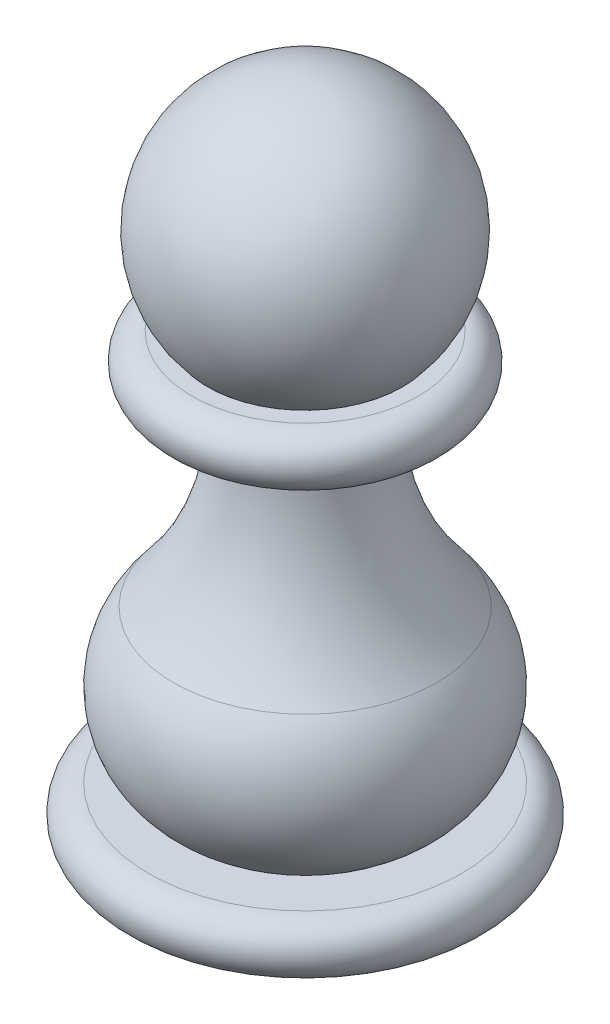
ISO-10303-21;
HEADER;
FILE_DESCRIPTION(('STEP AP214'),'2;1');
FILE_NAME('part.step','',(''),(''),'','','');
FILE_SCHEMA(('AUTOMOTIVE_DESIGN { 1 0 10303 214 1 1 1 1 }'));
ENDSEC;
DATA;
#1=APPLICATION_CONTEXT('core data for automotive mechanical design processes');
#2=APPLICATION_PROTOCOL_DEFINITION('international standard','automotive_design',2000,#1);
#3=PRODUCT_CONTEXT('',#1,'mechanical');
#4=PRODUCT('Part','Part','',(#3));
#5=PRODUCT_RELATED_PRODUCT_CATEGORY('part','',(#4));
#6=PRODUCT_DEFINITION_FORMATION('','',#4);
#7=PRODUCT_DEFINITION_CONTEXT('part definition',#1,'design');
#8=PRODUCT_DEFINITION('design','',#6,#7);
#9=PRODUCT_DEFINITION_SHAPE('','',#8);
#10=(LENGTH_UNIT() NAMED_UNIT(*) SI_UNIT(.MILLI.,.METRE.));
#11=(NAMED_UNIT(*) PLANE_ANGLE_UNIT() SI_UNIT($,.RADIAN.));
#12=(NAMED_UNIT(*) SI_UNIT($,.STERADIAN.) SOLID_ANGLE_UNIT());
#13=UNCERTAINTY_MEASURE_WITH_UNIT(LENGTH_MEASURE(1.E-05),#10,'distance_accuracy_value','');
#14=(GEOMETRIC_REPRESENTATION_CONTEXT(3) GLOBAL_UNCERTAINTY_ASSIGNED_CONTEXT((#13)) GLOBAL_UNIT_ASSIGNED_CONTEXT((#10,
#11,#12)) REPRESENTATION_CONTEXT('',''));
#15=CARTESIAN_POINT('',(0.,0.,0.));
#16=DIRECTION('',(0.,0.,1.));
#17=DIRECTION('',(1.,0.,0.));
#18=AXIS2_PLACEMENT_3D('',#15,#16,#17);
#19=CARTESIAN_POINT('',(0.,0.,0.));
#20=DIRECTION('',(0.,-1.,0.));
#21=DIRECTION('',(0.,0.,-1.));
#22=AXIS2_PLACEMENT_3D('',#19,#20,#21);
#23=PLANE('',#22);
#24=CARTESIAN_POINT('',(0.,0.,0.));
#25=DIRECTION('',(0.,-1.,0.));
#26=DIRECTION('',(0.,0.,-1.));
#27=AXIS2_PLACEMENT_3D('',#24,#25,#26);
#28=CIRCLE('',#27,9.);
#29=CARTESIAN_POINT('',(0.,0.,-9.));
#30=VERTEX_POINT('',#29);
#31=EDGE_CURVE('E10',#30,#30,#28,.T.);
#32=ORIENTED_EDGE('',*,*,#31,.T.);
#33=EDGE_LOOP('',(#32));
#34=FACE_BOUND('',#33,.T.);
#35=ADVANCED_FACE('F37',(#34),#23,.T.);
#36=CARTESIAN_POINT('',(0.,1.5,0.));
#37=DIRECTION('',(0.,-1.,0.));
#38=DIRECTION('',(0.,0.,-1.));
#39=AXIS2_PLACEMENT_3D('',#36,#37,#38);
#40=TOROIDAL_SURFACE('',#39,9.,1.5);
#41=CARTESIAN_POINT('',(0.,3.,0.));
#42=DIRECTION('',(0.,-1.,0.));
#43=DIRECTION('',(0.,0.,-1.));
#44=AXIS2_PLACEMENT_3D('',#41,#42,#43);
#45=CIRCLE('',#44,9.);
#46=CARTESIAN_POINT('',(0.,3.,-9.));
#47=VERTEX_POINT('',#46);
#48=EDGE_CURVE('E43',#47,#47,#45,.T.);
#49=ORIENTED_EDGE('',*,*,#48,.T.);
#50=EDGE_LOOP('',(#49));
#51=FACE_BOUND('',#50,.T.);
#52=ORIENTED_EDGE('',*,*,#31,.F.);
#53=EDGE_LOOP('',(#52));
#54=FACE_BOUND('',#53,.T.);
#55=ADVANCED_FACE('F81',(#51,#54),#40,.T.);
#56=CARTESIAN_POINT('',(9.,3.,0.));
#57=DIRECTION('',(0.,1.,0.));
#58=DIRECTION('',(0.,0.,1.));
#59=AXIS2_PLACEMENT_3D('',#56,#57,#58);
#60=PLANE('',#59);
#61=CARTESIAN_POINT('',(0.,3.,0.));
#62=DIRECTION('',(0.,-1.,0.));
#63=DIRECTION('',(0.,0.,-1.));
#64=AXIS2_PLACEMENT_3D('',#61,#62,#63);
#65=CIRCLE('',#64,6.5);
#66=CARTESIAN_POINT('',(0.,3.,-6.5));
#67=VERTEX_POINT('',#66);
#68=EDGE_CURVE('E47',#67,#67,#65,.T.);
#69=ORIENTED_EDGE('',*,*,#68,.T.);
#70=EDGE_LOOP('',(#69));
#71=FACE_BOUND('',#70,.T.);
#72=ORIENTED_EDGE('',*,*,#48,.F.);
#73=EDGE_LOOP('',(#72));
#74=FACE_BOUND('',#73,.T.);
#75=ADVANCED_FACE('F85',(#71,#74),#60,.T.);
#76=CARTESIAN_POINT('',(0.,7.87339717240448,0.));
#77=DIRECTION('',(0.,-1.,0.));
#78=DIRECTION('',(0.,0.,-1.));
#79=AXIS2_PLACEMENT_3D('',#76,#77,#78);
#80=DEGENERATE_TOROIDAL_SURFACE('',#79,3.,6.,.T.);
#81=CARTESIAN_POINT('',(0.,11.7704306233132,0.));
#82=DIRECTION('',(0.,-1.,0.));
#83=DIRECTION('',(0.,0.,-1.));
#84=AXIS2_PLACEMENT_3D('',#81,#82,#83);
#85=CIRCLE('',#84,7.56214097573703);
#86=CARTESIAN_POINT('',(0.,11.7704306233132,-7.56214097573703));
#87=VERTEX_POINT('',#86);
#88=EDGE_CURVE('E51',#87,#87,#85,.T.);
#89=ORIENTED_EDGE('',*,*,#88,.T.);
#90=EDGE_LOOP('',(#89));
#91=FACE_BOUND('',#90,.T.);
#92=ORIENTED_EDGE('',*,*,#68,.F.);
#93=EDGE_LOOP('',(#92));
#94=FACE_BOUND('',#93,.T.);
#95=ADVANCED_FACE('F89',(#91,#94),#80,.T.);
#96=CARTESIAN_POINT('',(0.,21.5130142505848,0.));
#97=DIRECTION('',(0.,-1.,0.));
#98=DIRECTION('',(0.,0.,-1.));
#99=AXIS2_PLACEMENT_3D('',#96,#97,#98);
#100=TOROIDAL_SURFACE('',#99,18.9674934150796,15.);
#101=CARTESIAN_POINT('',(0.,22.5,0.));
#102=DIRECTION('',(0.,-1.,0.));
#103=DIRECTION('',(0.,0.,-1.));
#104=AXIS2_PLACEMENT_3D('',#101,#102,#103);
#105=CIRCLE('',#104,4.);
#106=CARTESIAN_POINT('',(0.,22.5,-4.));
#107=VERTEX_POINT('',#106);
#108=EDGE_CURVE('E56',#107,#107,#105,.T.);
#109=ORIENTED_EDGE('',*,*,#108,.T.);
#110=EDGE_LOOP('',(#109));
#111=FACE_BOUND('',#110,.T.);
#112=ORIENTED_EDGE('',*,*,#88,.F.);
#113=EDGE_LOOP('',(#112));
#114=FACE_BOUND('',#113,.T.);
#115=ADVANCED_FACE('F96',(#111,#114),#100,.F.);
#116=CARTESIAN_POINT('',(4.,22.5,0.));
#117=DIRECTION('',(0.,-1.,0.));
#118=DIRECTION('',(0.,0.,-1.));
#119=AXIS2_PLACEMENT_3D('',#116,#117,#118);
#120=PLANE('',#119);
#121=CARTESIAN_POINT('',(0.,22.5,0.));
#122=DIRECTION('',(0.,-1.,0.));
#123=DIRECTION('',(0.,0.,-1.));
#124=AXIS2_PLACEMENT_3D('',#121,#122,#123);
#125=CIRCLE('',#124,6.5);
#126=CARTESIAN_POINT('',(0.,22.5,-6.5));
#127=VERTEX_POINT('',#126);
#128=EDGE_CURVE('E59',#127,#127,#125,.T.);
#129=ORIENTED_EDGE('',*,*,#128,.T.);
#130=EDGE_LOOP('',(#129));
#131=FACE_BOUND('',#130,.T.);
#132=ORIENTED_EDGE('',*,*,#108,.F.);
#133=EDGE_LOOP('',(#132));
#134=FACE_BOUND('',#133,.T.);
#135=ADVANCED_FACE('F100',(#131,#134),#120,.T.);
#136=CARTESIAN_POINT('',(0.,24.,0.));
#137=DIRECTION('',(0.,-1.,0.));
#138=DIRECTION('',(0.,0.,-1.));
#139=AXIS2_PLACEMENT_3D('',#136,#137,#138);
#140=TOROIDAL_SURFACE('',#139,6.5,1.5);
#141=CARTESIAN_POINT('',(0.,25.5,0.));
#142=DIRECTION('',(0.,-1.,0.));
#143=DIRECTION('',(0.,0.,-1.));
#144=AXIS2_PLACEMENT_3D('',#141,#142,#143);
#145=CIRCLE('',#144,6.5);
#146=CARTESIAN_POINT('',(0.,25.5,-6.5));
#147=VERTEX_POINT('',#146);
#148=EDGE_CURVE('E62',#147,#147,#145,.T.);
#149=ORIENTED_EDGE('',*,*,#148,.T.);
#150=EDGE_LOOP('',(#149));
#151=FACE_BOUND('',#150,.T.);
#152=ORIENTED_EDGE('',*,*,#128,.F.);
#153=EDGE_LOOP('',(#152));
#154=FACE_BOUND('',#153,.T.);
#155=ADVANCED_FACE('F78',(#151,#154),#140,.T.);
#156=CARTESIAN_POINT('',(6.5,25.5,0.));
#157=DIRECTION('',(0.,1.,0.));
#158=DIRECTION('',(0.,0.,1.));
#159=AXIS2_PLACEMENT_3D('',#156,#157,#158);
#160=PLANE('',#159);
#161=CARTESIAN_POINT('',(0.,25.5,0.));
#162=DIRECTION('',(0.,-1.,0.));
#163=DIRECTION('',(0.,0.,-1.));
#164=AXIS2_PLACEMENT_3D('',#161,#162,#163);
#165=CIRCLE('',#164,5.59016994374947);
#166=CARTESIAN_POINT('',(0.,25.5,-5.59016994374947));
#167=VERTEX_POINT('',#166);
#168=EDGE_CURVE('E65',#167,#167,#165,.T.);
#169=ORIENTED_EDGE('',*,*,#168,.T.);
#170=EDGE_LOOP('',(#169));
#171=FACE_BOUND('',#170,.T.);
#172=ORIENTED_EDGE('',*,*,#148,.F.);
#173=EDGE_LOOP('',(#172));
#174=FACE_BOUND('',#173,.T.);
#175=ADVANCED_FACE('F69',(#171,#174),#160,.T.);
#176=CARTESIAN_POINT('',(0.,30.5,0.));
#177=DIRECTION('',(0.,-1.,0.));
#178=DIRECTION('',(1.,0.,0.));
#179=AXIS2_PLACEMENT_3D('',#176,#177,#178);
#180=SPHERICAL_SURFACE('',#179,7.5);
#181=ORIENTED_EDGE('',*,*,#168,.F.);
#182=EDGE_LOOP('',(#181));
#183=FACE_BOUND('',#182,.T.);
#184=ADVANCED_FACE('F72',(#183),#180,.T.);
#185=CLOSED_SHELL('',(#35,#55,#75,#95,#115,#135,#155,#175,#184));
#186=MANIFOLD_SOLID_BREP('B2',#185);
#187=ADVANCED_BREP_SHAPE_REPRESENTATION('',(#18,#186),#14);
#188=SHAPE_DEFINITION_REPRESENTATION(#9,#187);
ENDSEC;
END-ISO-10303-21;
